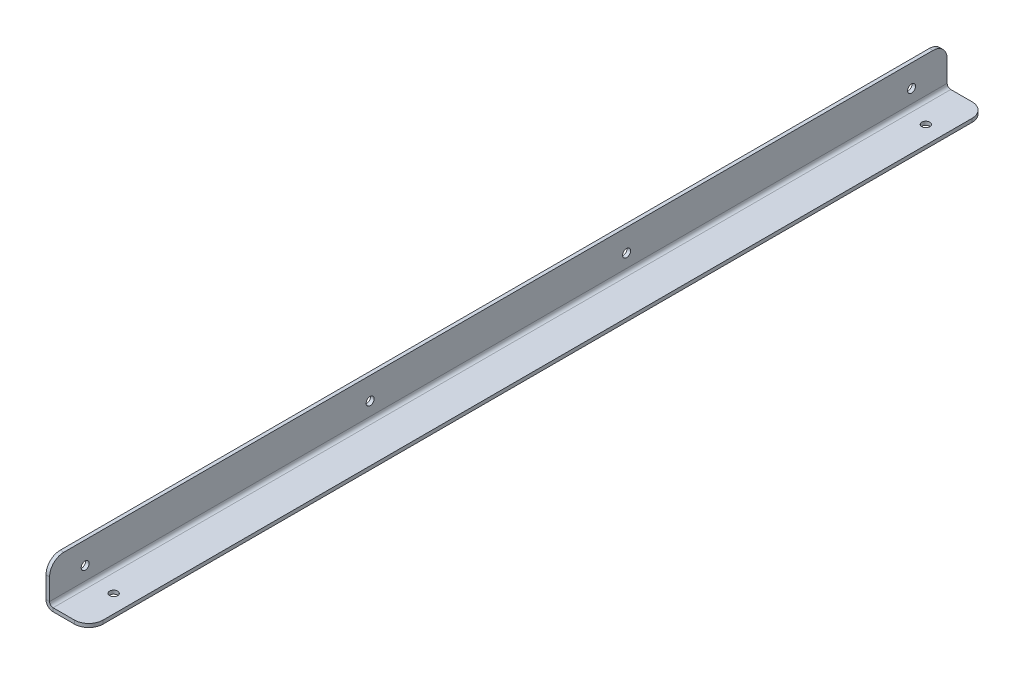
ISO-10303-21;
HEADER;
FILE_DESCRIPTION(('STEP AP214'),'2;1');
FILE_NAME('part.step','',(''),(''),'','','');
FILE_SCHEMA(('AUTOMOTIVE_DESIGN { 1 0 10303 214 1 1 1 1 }'));
ENDSEC;
DATA;
#1=APPLICATION_CONTEXT('core data for automotive mechanical design processes');
#2=APPLICATION_PROTOCOL_DEFINITION('international standard','automotive_design',2000,#1);
#3=PRODUCT_CONTEXT('',#1,'mechanical');
#4=PRODUCT('Part','Part','',(#3));
#5=PRODUCT_RELATED_PRODUCT_CATEGORY('part','',(#4));
#6=PRODUCT_DEFINITION_FORMATION('','',#4);
#7=PRODUCT_DEFINITION_CONTEXT('part definition',#1,'design');
#8=PRODUCT_DEFINITION('design','',#6,#7);
#9=PRODUCT_DEFINITION_SHAPE('','',#8);
#10=(LENGTH_UNIT() NAMED_UNIT(*) SI_UNIT(.MILLI.,.METRE.));
#11=(NAMED_UNIT(*) PLANE_ANGLE_UNIT() SI_UNIT($,.RADIAN.));
#12=(NAMED_UNIT(*) SI_UNIT($,.STERADIAN.) SOLID_ANGLE_UNIT());
#13=UNCERTAINTY_MEASURE_WITH_UNIT(LENGTH_MEASURE(1.E-05),#10,'distance_accuracy_value','');
#14=(GEOMETRIC_REPRESENTATION_CONTEXT(3) GLOBAL_UNCERTAINTY_ASSIGNED_CONTEXT((#13)) GLOBAL_UNIT_ASSIGNED_CONTEXT((#10,
#11,#12)) REPRESENTATION_CONTEXT('',''));
#15=CARTESIAN_POINT('',(0.,0.,0.));
#16=DIRECTION('',(0.,0.,1.));
#17=DIRECTION('',(1.,0.,0.));
#18=AXIS2_PLACEMENT_3D('',#15,#16,#17);
#19=CARTESIAN_POINT('',(0.,6.35000000000006,800.1));
#20=DIRECTION('',(0.,0.,1.));
#21=DIRECTION('',(1.,0.,0.));
#22=AXIS2_PLACEMENT_3D('',#19,#20,#21);
#23=PLANE('',#22);
#24=DIRECTION('',(1.,0.,0.));
#25=VECTOR('',#24,1.);
#26=CARTESIAN_POINT('',(0.,6.35000000000006,800.1));
#27=LINE('',#26,#25);
#28=CARTESIAN_POINT('',(0.,6.35000000000006,800.1));
#29=VERTEX_POINT('',#28);
#30=CARTESIAN_POINT('',(3.175,6.35000000000004,800.1));
#31=VERTEX_POINT('',#30);
#32=EDGE_CURVE('E140',#29,#31,#27,.T.);
#33=ORIENTED_EDGE('',*,*,#32,.F.);
#34=CARTESIAN_POINT('',(6.35,6.35000000000003,800.1));
#35=DIRECTION('',(0.,0.,-1.));
#36=DIRECTION('',(-1.,0.,0.));
#37=AXIS2_PLACEMENT_3D('',#34,#35,#36);
#38=CIRCLE('',#37,6.35);
#39=CARTESIAN_POINT('',(6.35000000000002,0.,800.1));
#40=VERTEX_POINT('',#39);
#41=EDGE_CURVE('E135',#29,#40,#38,.F.);
#42=ORIENTED_EDGE('',*,*,#41,.T.);
#43=DIRECTION('',(0.,-1.,0.));
#44=VECTOR('',#43,1.);
#45=CARTESIAN_POINT('',(6.35000000000001,3.17500000000002,800.1));
#46=LINE('',#45,#44);
#47=CARTESIAN_POINT('',(6.35000000000001,3.17500000000002,800.1));
#48=VERTEX_POINT('',#47);
#49=EDGE_CURVE('E129',#48,#40,#46,.T.);
#50=ORIENTED_EDGE('',*,*,#49,.F.);
#51=CARTESIAN_POINT('',(6.35,6.35000000000003,800.1));
#52=DIRECTION('',(0.,0.,1.));
#53=DIRECTION('',(1.,0.,0.));
#54=AXIS2_PLACEMENT_3D('',#51,#52,#53);
#55=CIRCLE('',#54,3.175);
#56=EDGE_CURVE('E133',#31,#48,#55,.T.);
#57=ORIENTED_EDGE('',*,*,#56,.F.);
#58=EDGE_LOOP('',(#33,#42,#50,#57));
#59=FACE_BOUND('',#58,.T.);
#60=ADVANCED_FACE('F39',(#59),#23,.T.);
#61=CARTESIAN_POINT('',(6.35000000000001,3.17500000000002,800.1));
#62=DIRECTION('',(0.,0.,1.));
#63=DIRECTION('',(1.,0.,0.));
#64=AXIS2_PLACEMENT_3D('',#61,#62,#63);
#65=PLANE('',#64);
#66=DIRECTION('',(0.,1.,0.));
#67=VECTOR('',#66,1.);
#68=CARTESIAN_POINT('',(3.175,38.1,800.1));
#69=LINE('',#68,#67);
#70=CARTESIAN_POINT('',(3.175,25.4,800.1));
#71=VERTEX_POINT('',#70);
#72=EDGE_CURVE('E167',#71,#31,#69,.F.);
#73=ORIENTED_EDGE('',*,*,#72,.F.);
#74=DIRECTION('',(1.,0.,0.));
#75=VECTOR('',#74,1.);
#76=CARTESIAN_POINT('',(6.35000000000001,25.4,800.1));
#77=LINE('',#76,#75);
#78=CARTESIAN_POINT('',(0.,25.4,800.1));
#79=VERTEX_POINT('',#78);
#80=EDGE_CURVE('E11',#71,#79,#77,.F.);
#81=ORIENTED_EDGE('',*,*,#80,.T.);
#82=DIRECTION('',(0.,-1.,0.));
#83=VECTOR('',#82,1.);
#84=CARTESIAN_POINT('',(0.,38.1,800.1));
#85=LINE('',#84,#83);
#86=EDGE_CURVE('E169',#79,#29,#85,.T.);
#87=ORIENTED_EDGE('',*,*,#86,.T.);
#88=ORIENTED_EDGE('',*,*,#32,.T.);
#89=EDGE_LOOP('',(#73,#81,#87,#88));
#90=FACE_BOUND('',#89,.T.);
#91=ADVANCED_FACE('F259',(#90),#65,.T.);
#92=CARTESIAN_POINT('',(6.35000000000002,0.,0.));
#93=DIRECTION('',(0.,0.,-1.));
#94=DIRECTION('',(-1.,0.,0.));
#95=AXIS2_PLACEMENT_3D('',#92,#93,#94);
#96=PLANE('',#95);
#97=DIRECTION('',(0.,1.,0.));
#98=VECTOR('',#97,1.);
#99=CARTESIAN_POINT('',(6.35000000000002,0.,0.));
#100=LINE('',#99,#98);
#101=CARTESIAN_POINT('',(6.35000000000002,0.,0.));
#102=VERTEX_POINT('',#101);
#103=CARTESIAN_POINT('',(6.35000000000001,3.17500000000002,0.));
#104=VERTEX_POINT('',#103);
#105=EDGE_CURVE('E141',#102,#104,#100,.T.);
#106=ORIENTED_EDGE('',*,*,#105,.F.);
#107=CARTESIAN_POINT('',(6.35,6.35000000000003,0.));
#108=DIRECTION('',(0.,0.,-1.));
#109=DIRECTION('',(-1.,0.,0.));
#110=AXIS2_PLACEMENT_3D('',#107,#108,#109);
#111=CIRCLE('',#110,6.35);
#112=CARTESIAN_POINT('',(0.,6.35000000000006,0.));
#113=VERTEX_POINT('',#112);
#114=EDGE_CURVE('E187',#113,#102,#111,.F.);
#115=ORIENTED_EDGE('',*,*,#114,.F.);
#116=DIRECTION('',(-1.,0.,0.));
#117=VECTOR('',#116,1.);
#118=CARTESIAN_POINT('',(3.175,6.35000000000004,0.));
#119=LINE('',#118,#117);
#120=CARTESIAN_POINT('',(3.175,6.35000000000004,0.));
#121=VERTEX_POINT('',#120);
#122=EDGE_CURVE('E204',#121,#113,#119,.T.);
#123=ORIENTED_EDGE('',*,*,#122,.F.);
#124=CARTESIAN_POINT('',(6.35,6.35000000000003,0.));
#125=DIRECTION('',(0.,0.,1.));
#126=DIRECTION('',(1.,0.,0.));
#127=AXIS2_PLACEMENT_3D('',#124,#125,#126);
#128=CIRCLE('',#127,3.175);
#129=EDGE_CURVE('E181',#121,#104,#128,.T.);
#130=ORIENTED_EDGE('',*,*,#129,.T.);
#131=EDGE_LOOP('',(#106,#115,#123,#130));
#132=FACE_BOUND('',#131,.T.);
#133=ADVANCED_FACE('F333',(#132),#96,.T.);
#134=CARTESIAN_POINT('',(3.175,6.35000000000004,0.));
#135=DIRECTION('',(0.,0.,-1.));
#136=DIRECTION('',(-1.,0.,0.));
#137=AXIS2_PLACEMENT_3D('',#134,#135,#136);
#138=PLANE('',#137);
#139=DIRECTION('',(1.,0.,0.));
#140=VECTOR('',#139,1.);
#141=CARTESIAN_POINT('',(0.,3.175,0.));
#142=LINE('',#141,#140);
#143=CARTESIAN_POINT('',(25.4,3.1750000000001,0.));
#144=VERTEX_POINT('',#143);
#145=EDGE_CURVE('E153',#104,#144,#142,.T.);
#146=ORIENTED_EDGE('',*,*,#145,.T.);
#147=DIRECTION('',(0.,-1.,0.));
#148=VECTOR('',#147,1.);
#149=CARTESIAN_POINT('',(25.4,6.35000000000014,0.));
#150=LINE('',#149,#148);
#151=CARTESIAN_POINT('',(25.4,0.,0.));
#152=VERTEX_POINT('',#151);
#153=EDGE_CURVE('E210',#144,#152,#150,.T.);
#154=ORIENTED_EDGE('',*,*,#153,.T.);
#155=DIRECTION('',(1.,0.,0.));
#156=VECTOR('',#155,1.);
#157=CARTESIAN_POINT('',(0.,0.,0.));
#158=LINE('',#157,#156);
#159=EDGE_CURVE('E176',#102,#152,#158,.T.);
#160=ORIENTED_EDGE('',*,*,#159,.F.);
#161=ORIENTED_EDGE('',*,*,#105,.T.);
#162=EDGE_LOOP('',(#146,#154,#160,#161));
#163=FACE_BOUND('',#162,.T.);
#164=ADVANCED_FACE('F356',(#163),#138,.T.);
#165=CARTESIAN_POINT('',(0.,0.,800.1));
#166=DIRECTION('',(0.,1.,0.));
#167=DIRECTION('',(-1.,0.,0.));
#168=AXIS2_PLACEMENT_3D('',#165,#166,#167);
#169=PLANE('',#168);
#170=CARTESIAN_POINT('',(22.225,0.,38.1));
#171=DIRECTION('',(0.,1.,0.));
#172=DIRECTION('',(0.,0.,1.));
#173=AXIS2_PLACEMENT_3D('',#170,#171,#172);
#174=CIRCLE('',#173,3.571875);
#175=CARTESIAN_POINT('',(22.225,0.,41.671875));
#176=VERTEX_POINT('',#175);
#177=EDGE_CURVE('E298',#176,#176,#174,.T.);
#178=ORIENTED_EDGE('',*,*,#177,.T.);
#179=EDGE_LOOP('',(#178));
#180=FACE_BOUND('',#179,.T.);
#181=CARTESIAN_POINT('',(22.225,0.,762.));
#182=DIRECTION('',(0.,1.,0.));
#183=DIRECTION('',(0.,0.,1.));
#184=AXIS2_PLACEMENT_3D('',#181,#182,#183);
#185=CIRCLE('',#184,3.571875);
#186=CARTESIAN_POINT('',(22.225,0.,765.571875));
#187=VERTEX_POINT('',#186);
#188=EDGE_CURVE('E292',#187,#187,#185,.T.);
#189=ORIENTED_EDGE('',*,*,#188,.T.);
#190=EDGE_LOOP('',(#189));
#191=FACE_BOUND('',#190,.T.);
#192=ORIENTED_EDGE('',*,*,#159,.T.);
#193=CARTESIAN_POINT('',(25.4,0.,12.7));
#194=DIRECTION('',(0.,1.,0.));
#195=DIRECTION('',(-1.,0.,0.));
#196=AXIS2_PLACEMENT_3D('',#193,#194,#195);
#197=CIRCLE('',#196,12.7);
#198=CARTESIAN_POINT('',(38.1,1.47023151924178E-13,12.7000000000003));
#199=VERTEX_POINT('',#198);
#200=EDGE_CURVE('E215',#152,#199,#197,.F.);
#201=ORIENTED_EDGE('',*,*,#200,.T.);
#202=DIRECTION('',(0.,0.,-1.));
#203=VECTOR('',#202,1.);
#204=CARTESIAN_POINT('',(38.1,1.47023151924178E-13,800.1));
#205=LINE('',#204,#203);
#206=CARTESIAN_POINT('',(38.1,1.47023151924178E-13,787.4));
#207=VERTEX_POINT('',#206);
#208=EDGE_CURVE('E201',#207,#199,#205,.T.);
#209=ORIENTED_EDGE('',*,*,#208,.F.);
#210=CARTESIAN_POINT('',(25.4,0.,787.4));
#211=DIRECTION('',(0.,1.,0.));
#212=DIRECTION('',(-1.,0.,0.));
#213=AXIS2_PLACEMENT_3D('',#210,#211,#212);
#214=CIRCLE('',#213,12.7);
#215=CARTESIAN_POINT('',(25.4,0.,800.1));
#216=VERTEX_POINT('',#215);
#217=EDGE_CURVE('E213',#207,#216,#214,.F.);
#218=ORIENTED_EDGE('',*,*,#217,.T.);
#219=DIRECTION('',(1.,0.,0.));
#220=VECTOR('',#219,1.);
#221=CARTESIAN_POINT('',(0.,0.,800.1));
#222=LINE('',#221,#220);
#223=EDGE_CURVE('E162',#40,#216,#222,.T.);
#224=ORIENTED_EDGE('',*,*,#223,.F.);
#225=DIRECTION('',(0.,0.,-1.));
#226=VECTOR('',#225,1.);
#227=CARTESIAN_POINT('',(6.35000000000002,0.,800.1));
#228=LINE('',#227,#226);
#229=EDGE_CURVE('E175',#40,#102,#228,.T.);
#230=ORIENTED_EDGE('',*,*,#229,.T.);
#231=EDGE_LOOP('',(#192,#201,#209,#218,#224,#230));
#232=FACE_BOUND('',#231,.T.);
#233=ADVANCED_FACE('F266',(#180,#191,#232),#169,.F.);
#234=CARTESIAN_POINT('',(38.1,3.17500000000015,800.1));
#235=DIRECTION('',(1.,0.,0.));
#236=DIRECTION('',(0.,1.,0.));
#237=AXIS2_PLACEMENT_3D('',#234,#235,#236);
#238=PLANE('',#237);
#239=ORIENTED_EDGE('',*,*,#208,.T.);
#240=DIRECTION('',(0.,-1.,0.));
#241=VECTOR('',#240,1.);
#242=CARTESIAN_POINT('',(38.1,3.17500000000015,12.7));
#243=LINE('',#242,#241);
#244=CARTESIAN_POINT('',(38.1,3.17500000000015,12.7000000000003));
#245=VERTEX_POINT('',#244);
#246=EDGE_CURVE('E220',#199,#245,#243,.F.);
#247=ORIENTED_EDGE('',*,*,#246,.T.);
#248=DIRECTION('',(0.,0.,-1.));
#249=VECTOR('',#248,1.);
#250=CARTESIAN_POINT('',(38.1,3.17500000000015,800.1));
#251=LINE('',#250,#249);
#252=CARTESIAN_POINT('',(38.1,3.17500000000015,787.4));
#253=VERTEX_POINT('',#252);
#254=EDGE_CURVE('E157',#253,#245,#251,.T.);
#255=ORIENTED_EDGE('',*,*,#254,.F.);
#256=DIRECTION('',(0.,-1.,0.));
#257=VECTOR('',#256,1.);
#258=CARTESIAN_POINT('',(38.1,3.17500000000015,787.4));
#259=LINE('',#258,#257);
#260=EDGE_CURVE('E217',#253,#207,#259,.T.);
#261=ORIENTED_EDGE('',*,*,#260,.T.);
#262=EDGE_LOOP('',(#239,#247,#255,#261));
#263=FACE_BOUND('',#262,.T.);
#264=ADVANCED_FACE('F309',(#263),#238,.T.);
#265=CARTESIAN_POINT('',(0.,3.175,800.1));
#266=DIRECTION('',(0.,1.,0.));
#267=DIRECTION('',(-1.,0.,0.));
#268=AXIS2_PLACEMENT_3D('',#265,#266,#267);
#269=PLANE('',#268);
#270=CARTESIAN_POINT('',(22.225,3.17500000000009,38.1));
#271=DIRECTION('',(0.,1.,0.));
#272=DIRECTION('',(0.,0.,1.));
#273=AXIS2_PLACEMENT_3D('',#270,#271,#272);
#274=CIRCLE('',#273,3.571875);
#275=CARTESIAN_POINT('',(22.225,3.17500000000009,41.671875));
#276=VERTEX_POINT('',#275);
#277=EDGE_CURVE('E301',#276,#276,#274,.T.);
#278=ORIENTED_EDGE('',*,*,#277,.F.);
#279=EDGE_LOOP('',(#278));
#280=FACE_BOUND('',#279,.T.);
#281=CARTESIAN_POINT('',(22.225,3.17500000000009,762.));
#282=DIRECTION('',(0.,1.,0.));
#283=DIRECTION('',(0.,0.,1.));
#284=AXIS2_PLACEMENT_3D('',#281,#282,#283);
#285=CIRCLE('',#284,3.571875);
#286=CARTESIAN_POINT('',(22.225,3.17500000000009,765.571875));
#287=VERTEX_POINT('',#286);
#288=EDGE_CURVE('E295',#287,#287,#285,.T.);
#289=ORIENTED_EDGE('',*,*,#288,.F.);
#290=EDGE_LOOP('',(#289));
#291=FACE_BOUND('',#290,.T.);
#292=ORIENTED_EDGE('',*,*,#254,.T.);
#293=CARTESIAN_POINT('',(25.4,3.1750000000001,12.7));
#294=DIRECTION('',(0.,1.,0.));
#295=DIRECTION('',(-1.,0.,0.));
#296=AXIS2_PLACEMENT_3D('',#293,#294,#295);
#297=CIRCLE('',#296,12.7);
#298=EDGE_CURVE('E224',#245,#144,#297,.T.);
#299=ORIENTED_EDGE('',*,*,#298,.T.);
#300=ORIENTED_EDGE('',*,*,#145,.F.);
#301=DIRECTION('',(0.,0.,-1.));
#302=VECTOR('',#301,1.);
#303=CARTESIAN_POINT('',(6.35000000000001,3.17500000000002,800.1));
#304=LINE('',#303,#302);
#305=EDGE_CURVE('E147',#48,#104,#304,.T.);
#306=ORIENTED_EDGE('',*,*,#305,.F.);
#307=DIRECTION('',(1.,0.,0.));
#308=VECTOR('',#307,1.);
#309=CARTESIAN_POINT('',(0.,3.175,800.1));
#310=LINE('',#309,#308);
#311=CARTESIAN_POINT('',(25.4,3.1750000000001,800.1));
#312=VERTEX_POINT('',#311);
#313=EDGE_CURVE('E150',#48,#312,#310,.T.);
#314=ORIENTED_EDGE('',*,*,#313,.T.);
#315=CARTESIAN_POINT('',(25.4,3.1750000000001,787.4));
#316=DIRECTION('',(0.,1.,0.));
#317=DIRECTION('',(-1.,0.,0.));
#318=AXIS2_PLACEMENT_3D('',#315,#316,#317);
#319=CIRCLE('',#318,12.7);
#320=EDGE_CURVE('E222',#312,#253,#319,.T.);
#321=ORIENTED_EDGE('',*,*,#320,.T.);
#322=EDGE_LOOP('',(#292,#299,#300,#306,#314,#321));
#323=FACE_BOUND('',#322,.T.);
#324=ADVANCED_FACE('F149',(#280,#291,#323),#269,.T.);
#325=CARTESIAN_POINT('',(6.35,6.35000000000003,800.1));
#326=DIRECTION('',(0.,0.,-1.));
#327=DIRECTION('',(-1.,0.,0.));
#328=AXIS2_PLACEMENT_3D('',#325,#326,#327);
#329=CYLINDRICAL_SURFACE('',#328,3.175);
#330=ORIENTED_EDGE('',*,*,#129,.F.);
#331=DIRECTION('',(0.,0.,-1.));
#332=VECTOR('',#331,1.);
#333=CARTESIAN_POINT('',(3.175,6.35000000000004,800.1));
#334=LINE('',#333,#332);
#335=EDGE_CURVE('E158',#31,#121,#334,.T.);
#336=ORIENTED_EDGE('',*,*,#335,.F.);
#337=ORIENTED_EDGE('',*,*,#56,.T.);
#338=ORIENTED_EDGE('',*,*,#305,.T.);
#339=EDGE_LOOP('',(#330,#336,#337,#338));
#340=FACE_BOUND('',#339,.T.);
#341=ADVANCED_FACE('F165',(#340),#329,.F.);
#342=CARTESIAN_POINT('',(3.175,38.1,800.1));
#343=DIRECTION('',(1.,0.,0.));
#344=DIRECTION('',(0.,0.,-1.));
#345=AXIS2_PLACEMENT_3D('',#342,#343,#344);
#346=PLANE('',#345);
#347=CARTESIAN_POINT('',(3.175,18.25625,768.35));
#348=DIRECTION('',(1.,0.,0.));
#349=DIRECTION('',(0.,0.,-1.));
#350=AXIS2_PLACEMENT_3D('',#347,#348,#349);
#351=CIRCLE('',#350,3.57187499999999);
#352=CARTESIAN_POINT('',(3.175,18.25625,764.778125));
#353=VERTEX_POINT('',#352);
#354=EDGE_CURVE('E289',#353,#353,#351,.T.);
#355=ORIENTED_EDGE('',*,*,#354,.F.);
#356=EDGE_LOOP('',(#355));
#357=FACE_BOUND('',#356,.T.);
#358=CARTESIAN_POINT('',(3.175,18.25625,514.35));
#359=DIRECTION('',(1.,0.,0.));
#360=DIRECTION('',(0.,0.,-1.));
#361=AXIS2_PLACEMENT_3D('',#358,#359,#360);
#362=CIRCLE('',#361,3.57187499999999);
#363=CARTESIAN_POINT('',(3.175,18.25625,510.778125));
#364=VERTEX_POINT('',#363);
#365=EDGE_CURVE('E283',#364,#364,#362,.T.);
#366=ORIENTED_EDGE('',*,*,#365,.F.);
#367=EDGE_LOOP('',(#366));
#368=FACE_BOUND('',#367,.T.);
#369=CARTESIAN_POINT('',(3.175,18.25625,285.75));
#370=DIRECTION('',(1.,0.,0.));
#371=DIRECTION('',(0.,0.,-1.));
#372=AXIS2_PLACEMENT_3D('',#369,#370,#371);
#373=CIRCLE('',#372,3.57187499999999);
#374=CARTESIAN_POINT('',(3.175,18.25625,282.178125));
#375=VERTEX_POINT('',#374);
#376=EDGE_CURVE('E277',#375,#375,#373,.T.);
#377=ORIENTED_EDGE('',*,*,#376,.F.);
#378=EDGE_LOOP('',(#377));
#379=FACE_BOUND('',#378,.T.);
#380=CARTESIAN_POINT('',(3.175,18.25625,31.7499999999999));
#381=DIRECTION('',(1.,0.,0.));
#382=DIRECTION('',(0.,0.,-1.));
#383=AXIS2_PLACEMENT_3D('',#380,#381,#382);
#384=CIRCLE('',#383,3.57187499999999);
#385=CARTESIAN_POINT('',(3.175,18.25625,28.178125));
#386=VERTEX_POINT('',#385);
#387=EDGE_CURVE('E271',#386,#386,#384,.T.);
#388=ORIENTED_EDGE('',*,*,#387,.F.);
#389=EDGE_LOOP('',(#388));
#390=FACE_BOUND('',#389,.T.);
#391=DIRECTION('',(0.,1.,0.));
#392=VECTOR('',#391,1.);
#393=CARTESIAN_POINT('',(3.175,38.1,0.));
#394=LINE('',#393,#392);
#395=CARTESIAN_POINT('',(3.175,25.4,0.));
#396=VERTEX_POINT('',#395);
#397=EDGE_CURVE('E183',#396,#121,#394,.F.);
#398=ORIENTED_EDGE('',*,*,#397,.F.);
#399=CARTESIAN_POINT('',(3.175,25.4,12.7));
#400=DIRECTION('',(1.,0.,0.));
#401=DIRECTION('',(0.,0.,-1.));
#402=AXIS2_PLACEMENT_3D('',#399,#400,#401);
#403=CIRCLE('',#402,12.7);
#404=CARTESIAN_POINT('',(3.175,38.1,12.7000000000003));
#405=VERTEX_POINT('',#404);
#406=EDGE_CURVE('E231',#396,#405,#403,.T.);
#407=ORIENTED_EDGE('',*,*,#406,.T.);
#408=DIRECTION('',(0.,0.,-1.));
#409=VECTOR('',#408,1.);
#410=CARTESIAN_POINT('',(3.175,38.1,800.1));
#411=LINE('',#410,#409);
#412=CARTESIAN_POINT('',(3.175,38.1,787.4));
#413=VERTEX_POINT('',#412);
#414=EDGE_CURVE('E197',#413,#405,#411,.T.);
#415=ORIENTED_EDGE('',*,*,#414,.F.);
#416=CARTESIAN_POINT('',(3.175,25.4,787.4));
#417=DIRECTION('',(1.,0.,0.));
#418=DIRECTION('',(0.,0.,-1.));
#419=AXIS2_PLACEMENT_3D('',#416,#417,#418);
#420=CIRCLE('',#419,12.7);
#421=EDGE_CURVE('E229',#413,#71,#420,.T.);
#422=ORIENTED_EDGE('',*,*,#421,.T.);
#423=ORIENTED_EDGE('',*,*,#72,.T.);
#424=ORIENTED_EDGE('',*,*,#335,.T.);
#425=EDGE_LOOP('',(#398,#407,#415,#422,#423,#424));
#426=FACE_BOUND('',#425,.T.);
#427=ADVANCED_FACE('F254',(#357,#368,#379,#390,#426),#346,.T.);
#428=CARTESIAN_POINT('',(0.,38.1,800.1));
#429=DIRECTION('',(0.,1.,0.));
#430=DIRECTION('',(0.,0.,1.));
#431=AXIS2_PLACEMENT_3D('',#428,#429,#430);
#432=PLANE('',#431);
#433=ORIENTED_EDGE('',*,*,#414,.T.);
#434=DIRECTION('',(1.,0.,0.));
#435=VECTOR('',#434,1.);
#436=CARTESIAN_POINT('',(0.,38.1,12.7));
#437=LINE('',#436,#435);
#438=CARTESIAN_POINT('',(0.,38.1,12.7000000000003));
#439=VERTEX_POINT('',#438);
#440=EDGE_CURVE('E60',#405,#439,#437,.F.);
#441=ORIENTED_EDGE('',*,*,#440,.T.);
#442=DIRECTION('',(0.,0.,-1.));
#443=VECTOR('',#442,1.);
#444=CARTESIAN_POINT('',(0.,38.1,800.1));
#445=LINE('',#444,#443);
#446=CARTESIAN_POINT('',(0.,38.1,787.4));
#447=VERTEX_POINT('',#446);
#448=EDGE_CURVE('E195',#447,#439,#445,.T.);
#449=ORIENTED_EDGE('',*,*,#448,.F.);
#450=DIRECTION('',(1.,0.,0.));
#451=VECTOR('',#450,1.);
#452=CARTESIAN_POINT('',(0.,38.1,787.4));
#453=LINE('',#452,#451);
#454=EDGE_CURVE('E233',#447,#413,#453,.T.);
#455=ORIENTED_EDGE('',*,*,#454,.T.);
#456=EDGE_LOOP('',(#433,#441,#449,#455));
#457=FACE_BOUND('',#456,.T.);
#458=ADVANCED_FACE('F255',(#457),#432,.T.);
#459=CARTESIAN_POINT('',(0.,38.1,800.1));
#460=DIRECTION('',(1.,0.,0.));
#461=DIRECTION('',(0.,0.,-1.));
#462=AXIS2_PLACEMENT_3D('',#459,#460,#461);
#463=PLANE('',#462);
#464=CARTESIAN_POINT('',(0.,18.25625,768.35));
#465=DIRECTION('',(1.,0.,0.));
#466=DIRECTION('',(0.,0.,-1.));
#467=AXIS2_PLACEMENT_3D('',#464,#465,#466);
#468=CIRCLE('',#467,3.571875);
#469=CARTESIAN_POINT('',(0.,18.25625,764.778125));
#470=VERTEX_POINT('',#469);
#471=EDGE_CURVE('E286',#470,#470,#468,.T.);
#472=ORIENTED_EDGE('',*,*,#471,.T.);
#473=EDGE_LOOP('',(#472));
#474=FACE_BOUND('',#473,.T.);
#475=CARTESIAN_POINT('',(0.,18.25625,514.35));
#476=DIRECTION('',(1.,0.,0.));
#477=DIRECTION('',(0.,0.,-1.));
#478=AXIS2_PLACEMENT_3D('',#475,#476,#477);
#479=CIRCLE('',#478,3.571875);
#480=CARTESIAN_POINT('',(0.,18.25625,510.778125));
#481=VERTEX_POINT('',#480);
#482=EDGE_CURVE('E280',#481,#481,#479,.T.);
#483=ORIENTED_EDGE('',*,*,#482,.T.);
#484=EDGE_LOOP('',(#483));
#485=FACE_BOUND('',#484,.T.);
#486=CARTESIAN_POINT('',(0.,18.25625,285.75));
#487=DIRECTION('',(1.,0.,0.));
#488=DIRECTION('',(0.,0.,-1.));
#489=AXIS2_PLACEMENT_3D('',#486,#487,#488);
#490=CIRCLE('',#489,3.571875);
#491=CARTESIAN_POINT('',(0.,18.25625,282.178125));
#492=VERTEX_POINT('',#491);
#493=EDGE_CURVE('E274',#492,#492,#490,.T.);
#494=ORIENTED_EDGE('',*,*,#493,.T.);
#495=EDGE_LOOP('',(#494));
#496=FACE_BOUND('',#495,.T.);
#497=CARTESIAN_POINT('',(0.,18.25625,31.7499999999999));
#498=DIRECTION('',(1.,0.,0.));
#499=DIRECTION('',(0.,0.,-1.));
#500=AXIS2_PLACEMENT_3D('',#497,#498,#499);
#501=CIRCLE('',#500,3.571875);
#502=CARTESIAN_POINT('',(0.,18.25625,28.1781249999999));
#503=VERTEX_POINT('',#502);
#504=EDGE_CURVE('E179',#503,#503,#501,.T.);
#505=ORIENTED_EDGE('',*,*,#504,.T.);
#506=EDGE_LOOP('',(#505));
#507=FACE_BOUND('',#506,.T.);
#508=ORIENTED_EDGE('',*,*,#448,.T.);
#509=CARTESIAN_POINT('',(0.,25.4,12.7));
#510=DIRECTION('',(1.,0.,0.));
#511=DIRECTION('',(0.,0.,-1.));
#512=AXIS2_PLACEMENT_3D('',#509,#510,#511);
#513=CIRCLE('',#512,12.7);
#514=CARTESIAN_POINT('',(0.,25.4,0.));
#515=VERTEX_POINT('',#514);
#516=EDGE_CURVE('E239',#439,#515,#513,.F.);
#517=ORIENTED_EDGE('',*,*,#516,.T.);
#518=DIRECTION('',(0.,-1.,0.));
#519=VECTOR('',#518,1.);
#520=CARTESIAN_POINT('',(0.,38.1,0.));
#521=LINE('',#520,#519);
#522=EDGE_CURVE('E185',#515,#113,#521,.T.);
#523=ORIENTED_EDGE('',*,*,#522,.T.);
#524=DIRECTION('',(0.,0.,-1.));
#525=VECTOR('',#524,1.);
#526=CARTESIAN_POINT('',(0.,6.35000000000006,800.1));
#527=LINE('',#526,#525);
#528=EDGE_CURVE('E192',#29,#113,#527,.T.);
#529=ORIENTED_EDGE('',*,*,#528,.F.);
#530=ORIENTED_EDGE('',*,*,#86,.F.);
#531=CARTESIAN_POINT('',(0.,25.4,787.4));
#532=DIRECTION('',(1.,0.,0.));
#533=DIRECTION('',(0.,0.,-1.));
#534=AXIS2_PLACEMENT_3D('',#531,#532,#533);
#535=CIRCLE('',#534,12.7);
#536=EDGE_CURVE('E237',#79,#447,#535,.F.);
#537=ORIENTED_EDGE('',*,*,#536,.T.);
#538=EDGE_LOOP('',(#508,#517,#523,#529,#530,#537));
#539=FACE_BOUND('',#538,.T.);
#540=ADVANCED_FACE('F243',(#474,#485,#496,#507,#539),#463,.F.);
#541=CARTESIAN_POINT('',(6.35,6.35000000000003,800.1));
#542=DIRECTION('',(0.,0.,-1.));
#543=DIRECTION('',(-1.,0.,0.));
#544=AXIS2_PLACEMENT_3D('',#541,#542,#543);
#545=CYLINDRICAL_SURFACE('',#544,6.35);
#546=ORIENTED_EDGE('',*,*,#114,.T.);
#547=ORIENTED_EDGE('',*,*,#229,.F.);
#548=ORIENTED_EDGE('',*,*,#41,.F.);
#549=ORIENTED_EDGE('',*,*,#528,.T.);
#550=EDGE_LOOP('',(#546,#547,#548,#549));
#551=FACE_BOUND('',#550,.T.);
#552=ADVANCED_FACE('F262',(#551),#545,.T.);
#553=CARTESIAN_POINT('',(6.35,6.35000000000003,800.1));
#554=DIRECTION('',(0.,0.,1.));
#555=DIRECTION('',(1.,0.,0.));
#556=AXIS2_PLACEMENT_3D('',#553,#554,#555);
#557=PLANE('',#556);
#558=ORIENTED_EDGE('',*,*,#223,.T.);
#559=DIRECTION('',(0.,-1.,0.));
#560=VECTOR('',#559,1.);
#561=CARTESIAN_POINT('',(25.4,6.35000000000011,800.1));
#562=LINE('',#561,#560);
#563=EDGE_CURVE('E47',#216,#312,#562,.F.);
#564=ORIENTED_EDGE('',*,*,#563,.T.);
#565=ORIENTED_EDGE('',*,*,#313,.F.);
#566=ORIENTED_EDGE('',*,*,#49,.T.);
#567=EDGE_LOOP('',(#558,#564,#565,#566));
#568=FACE_BOUND('',#567,.T.);
#569=ADVANCED_FACE('F160',(#568),#557,.T.);
#570=CARTESIAN_POINT('',(6.35,6.35000000000003,0.));
#571=DIRECTION('',(0.,0.,1.));
#572=DIRECTION('',(1.,0.,0.));
#573=AXIS2_PLACEMENT_3D('',#570,#571,#572);
#574=PLANE('',#573);
#575=ORIENTED_EDGE('',*,*,#522,.F.);
#576=DIRECTION('',(1.,0.,0.));
#577=VECTOR('',#576,1.);
#578=CARTESIAN_POINT('',(3.175,25.4,0.));
#579=LINE('',#578,#577);
#580=EDGE_CURVE('E226',#515,#396,#579,.T.);
#581=ORIENTED_EDGE('',*,*,#580,.T.);
#582=ORIENTED_EDGE('',*,*,#397,.T.);
#583=ORIENTED_EDGE('',*,*,#122,.T.);
#584=EDGE_LOOP('',(#575,#581,#582,#583));
#585=FACE_BOUND('',#584,.T.);
#586=ADVANCED_FACE('F248',(#585),#574,.F.);
#587=CARTESIAN_POINT('',(25.4,6.35000000000014,12.7));
#588=DIRECTION('',(0.,-1.,0.));
#589=DIRECTION('',(1.,0.,0.));
#590=AXIS2_PLACEMENT_3D('',#587,#588,#589);
#591=CYLINDRICAL_SURFACE('',#590,12.7);
#592=ORIENTED_EDGE('',*,*,#298,.F.);
#593=ORIENTED_EDGE('',*,*,#246,.F.);
#594=ORIENTED_EDGE('',*,*,#200,.F.);
#595=ORIENTED_EDGE('',*,*,#153,.F.);
#596=EDGE_LOOP('',(#592,#593,#594,#595));
#597=FACE_BOUND('',#596,.T.);
#598=ADVANCED_FACE('F337',(#597),#591,.T.);
#599=CARTESIAN_POINT('',(6.35,25.4,12.7));
#600=DIRECTION('',(-1.,0.,0.));
#601=DIRECTION('',(0.,0.,1.));
#602=AXIS2_PLACEMENT_3D('',#599,#600,#601);
#603=CYLINDRICAL_SURFACE('',#602,12.7);
#604=ORIENTED_EDGE('',*,*,#516,.F.);
#605=ORIENTED_EDGE('',*,*,#440,.F.);
#606=ORIENTED_EDGE('',*,*,#406,.F.);
#607=ORIENTED_EDGE('',*,*,#580,.F.);
#608=EDGE_LOOP('',(#604,#605,#606,#607));
#609=FACE_BOUND('',#608,.T.);
#610=ADVANCED_FACE('F251',(#609),#603,.T.);
#611=CARTESIAN_POINT('',(25.4,3.17500000000009,787.4));
#612=DIRECTION('',(0.,-1.,0.));
#613=DIRECTION('',(1.,0.,0.));
#614=AXIS2_PLACEMENT_3D('',#611,#612,#613);
#615=CYLINDRICAL_SURFACE('',#614,12.7);
#616=ORIENTED_EDGE('',*,*,#320,.F.);
#617=ORIENTED_EDGE('',*,*,#563,.F.);
#618=ORIENTED_EDGE('',*,*,#217,.F.);
#619=ORIENTED_EDGE('',*,*,#260,.F.);
#620=EDGE_LOOP('',(#616,#617,#618,#619));
#621=FACE_BOUND('',#620,.T.);
#622=ADVANCED_FACE('F342',(#621),#615,.T.);
#623=CARTESIAN_POINT('',(0.,25.4,787.4));
#624=DIRECTION('',(1.,0.,0.));
#625=DIRECTION('',(0.,0.,-1.));
#626=AXIS2_PLACEMENT_3D('',#623,#624,#625);
#627=CYLINDRICAL_SURFACE('',#626,12.7);
#628=ORIENTED_EDGE('',*,*,#536,.F.);
#629=ORIENTED_EDGE('',*,*,#80,.F.);
#630=ORIENTED_EDGE('',*,*,#421,.F.);
#631=ORIENTED_EDGE('',*,*,#454,.F.);
#632=EDGE_LOOP('',(#628,#629,#630,#631));
#633=FACE_BOUND('',#632,.T.);
#634=ADVANCED_FACE('F41',(#633),#627,.T.);
#635=CARTESIAN_POINT('',(3.175,18.25625,31.7499999999999));
#636=DIRECTION('',(1.,0.,0.));
#637=DIRECTION('',(0.,0.,-1.));
#638=AXIS2_PLACEMENT_3D('',#635,#636,#637);
#639=CYLINDRICAL_SURFACE('',#638,3.57187499999999);
#640=ORIENTED_EDGE('',*,*,#504,.F.);
#641=EDGE_LOOP('',(#640));
#642=FACE_BOUND('',#641,.T.);
#643=ORIENTED_EDGE('',*,*,#387,.T.);
#644=EDGE_LOOP('',(#643));
#645=FACE_BOUND('',#644,.T.);
#646=ADVANCED_FACE('F348',(#642,#645),#639,.F.);
#647=CARTESIAN_POINT('',(3.175,18.25625,285.75));
#648=DIRECTION('',(1.,0.,0.));
#649=DIRECTION('',(0.,0.,-1.));
#650=AXIS2_PLACEMENT_3D('',#647,#648,#649);
#651=CYLINDRICAL_SURFACE('',#650,3.57187499999999);
#652=ORIENTED_EDGE('',*,*,#493,.F.);
#653=EDGE_LOOP('',(#652));
#654=FACE_BOUND('',#653,.T.);
#655=ORIENTED_EDGE('',*,*,#376,.T.);
#656=EDGE_LOOP('',(#655));
#657=FACE_BOUND('',#656,.T.);
#658=ADVANCED_FACE('F387',(#654,#657),#651,.F.);
#659=CARTESIAN_POINT('',(3.175,18.25625,514.35));
#660=DIRECTION('',(1.,0.,0.));
#661=DIRECTION('',(0.,0.,-1.));
#662=AXIS2_PLACEMENT_3D('',#659,#660,#661);
#663=CYLINDRICAL_SURFACE('',#662,3.57187499999999);
#664=ORIENTED_EDGE('',*,*,#482,.F.);
#665=EDGE_LOOP('',(#664));
#666=FACE_BOUND('',#665,.T.);
#667=ORIENTED_EDGE('',*,*,#365,.T.);
#668=EDGE_LOOP('',(#667));
#669=FACE_BOUND('',#668,.T.);
#670=ADVANCED_FACE('F324',(#666,#669),#663,.F.);
#671=CARTESIAN_POINT('',(3.175,18.25625,768.35));
#672=DIRECTION('',(1.,0.,0.));
#673=DIRECTION('',(0.,0.,-1.));
#674=AXIS2_PLACEMENT_3D('',#671,#672,#673);
#675=CYLINDRICAL_SURFACE('',#674,3.57187499999999);
#676=ORIENTED_EDGE('',*,*,#471,.F.);
#677=EDGE_LOOP('',(#676));
#678=FACE_BOUND('',#677,.T.);
#679=ORIENTED_EDGE('',*,*,#354,.T.);
#680=EDGE_LOOP('',(#679));
#681=FACE_BOUND('',#680,.T.);
#682=ADVANCED_FACE('F315',(#678,#681),#675,.F.);
#683=CARTESIAN_POINT('',(22.225,3.17500000000009,762.));
#684=DIRECTION('',(0.,1.,0.));
#685=DIRECTION('',(0.,0.,1.));
#686=AXIS2_PLACEMENT_3D('',#683,#684,#685);
#687=CYLINDRICAL_SURFACE('',#686,3.571875);
#688=ORIENTED_EDGE('',*,*,#188,.F.);
#689=EDGE_LOOP('',(#688));
#690=FACE_BOUND('',#689,.T.);
#691=ORIENTED_EDGE('',*,*,#288,.T.);
#692=EDGE_LOOP('',(#691));
#693=FACE_BOUND('',#692,.T.);
#694=ADVANCED_FACE('F313',(#690,#693),#687,.F.);
#695=CARTESIAN_POINT('',(22.225,3.17500000000009,38.1));
#696=DIRECTION('',(0.,1.,0.));
#697=DIRECTION('',(0.,0.,1.));
#698=AXIS2_PLACEMENT_3D('',#695,#696,#697);
#699=CYLINDRICAL_SURFACE('',#698,3.571875);
#700=ORIENTED_EDGE('',*,*,#177,.F.);
#701=EDGE_LOOP('',(#700));
#702=FACE_BOUND('',#701,.T.);
#703=ORIENTED_EDGE('',*,*,#277,.T.);
#704=EDGE_LOOP('',(#703));
#705=FACE_BOUND('',#704,.T.);
#706=ADVANCED_FACE('F305',(#702,#705),#699,.F.);
#707=CLOSED_SHELL('',(#60,#91,#133,#164,#233,#264,#324,#341,#427,#458,#540,#552,#569,#586,#598,
#610,#622,#634,#646,#658,#670,#682,#694,#706));
#708=MANIFOLD_SOLID_BREP('B2',#707);
#709=ADVANCED_BREP_SHAPE_REPRESENTATION('',(#18,#708),#14);
#710=SHAPE_DEFINITION_REPRESENTATION(#9,#709);
ENDSEC;
END-ISO-10303-21;
